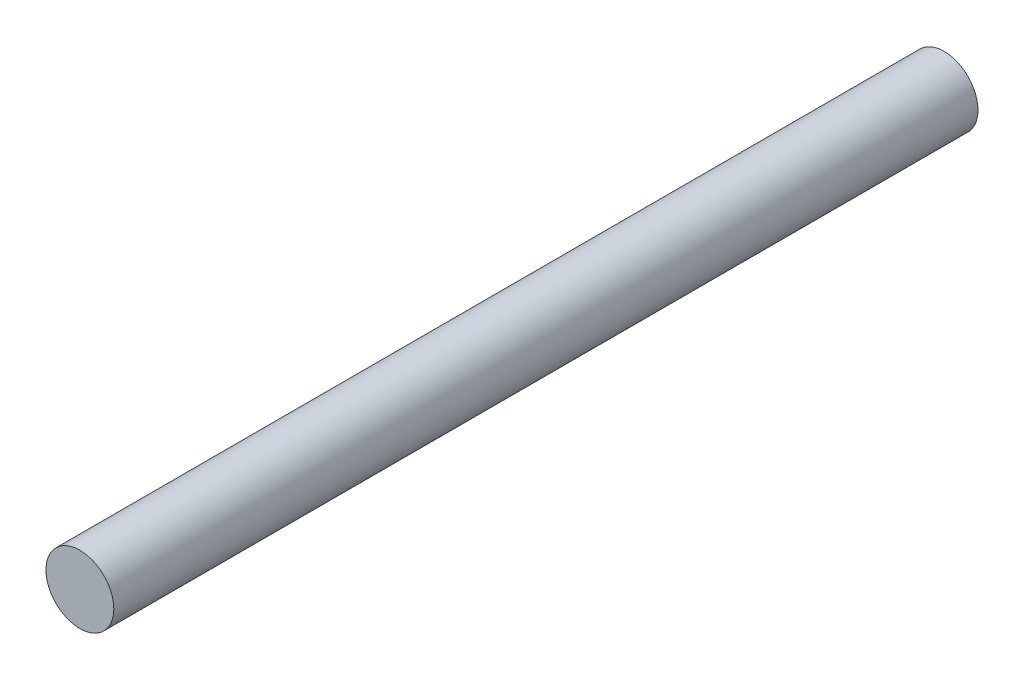
ISO-10303-21;
HEADER;
FILE_DESCRIPTION(('STEP AP214'),'2;1');
FILE_NAME('part.step','',(''),(''),'','','');
FILE_SCHEMA(('AUTOMOTIVE_DESIGN { 1 0 10303 214 1 1 1 1 }'));
ENDSEC;
DATA;
#1=APPLICATION_CONTEXT('core data for automotive mechanical design processes');
#2=APPLICATION_PROTOCOL_DEFINITION('international standard','automotive_design',2000,#1);
#3=PRODUCT_CONTEXT('',#1,'mechanical');
#4=PRODUCT('Part','Part','',(#3));
#5=PRODUCT_RELATED_PRODUCT_CATEGORY('part','',(#4));
#6=PRODUCT_DEFINITION_FORMATION('','',#4);
#7=PRODUCT_DEFINITION_CONTEXT('part definition',#1,'design');
#8=PRODUCT_DEFINITION('design','',#6,#7);
#9=PRODUCT_DEFINITION_SHAPE('','',#8);
#10=(LENGTH_UNIT() NAMED_UNIT(*) SI_UNIT(.MILLI.,.METRE.));
#11=(NAMED_UNIT(*) PLANE_ANGLE_UNIT() SI_UNIT($,.RADIAN.));
#12=(NAMED_UNIT(*) SI_UNIT($,.STERADIAN.) SOLID_ANGLE_UNIT());
#13=UNCERTAINTY_MEASURE_WITH_UNIT(LENGTH_MEASURE(1.E-05),#10,'distance_accuracy_value','');
#14=(GEOMETRIC_REPRESENTATION_CONTEXT(3) GLOBAL_UNCERTAINTY_ASSIGNED_CONTEXT((#13)) GLOBAL_UNIT_ASSIGNED_CONTEXT((#10,
#11,#12)) REPRESENTATION_CONTEXT('',''));
#15=CARTESIAN_POINT('',(0.,0.,0.));
#16=DIRECTION('',(0.,0.,1.));
#17=DIRECTION('',(1.,0.,0.));
#18=AXIS2_PLACEMENT_3D('',#15,#16,#17);
#19=CARTESIAN_POINT('',(0.,0.,-53.2));
#20=DIRECTION('',(0.,0.,1.));
#21=DIRECTION('',(1.,0.,0.));
#22=AXIS2_PLACEMENT_3D('',#19,#20,#21);
#23=CYLINDRICAL_SURFACE('',#22,8.89);
#24=CARTESIAN_POINT('',(0.,0.,-53.2));
#25=DIRECTION('',(0.,0.,1.));
#26=DIRECTION('',(1.,0.,0.));
#27=AXIS2_PLACEMENT_3D('',#24,#25,#26);
#28=CIRCLE('',#27,8.89);
#29=CARTESIAN_POINT('',(8.89,0.,-53.2));
#30=VERTEX_POINT('',#29);
#31=EDGE_CURVE('E10',#30,#30,#28,.T.);
#32=ORIENTED_EDGE('',*,*,#31,.T.);
#33=EDGE_LOOP('',(#32));
#34=FACE_BOUND('',#33,.T.);
#35=CARTESIAN_POINT('',(0.,0.,173.2));
#36=DIRECTION('',(0.,0.,1.));
#37=DIRECTION('',(1.,0.,0.));
#38=AXIS2_PLACEMENT_3D('',#35,#36,#37);
#39=CIRCLE('',#38,8.89);
#40=CARTESIAN_POINT('',(8.89,0.,173.2));
#41=VERTEX_POINT('',#40);
#42=EDGE_CURVE('E43',#41,#41,#39,.T.);
#43=ORIENTED_EDGE('',*,*,#42,.F.);
#44=EDGE_LOOP('',(#43));
#45=FACE_BOUND('',#44,.T.);
#46=ADVANCED_FACE('F37',(#34,#45),#23,.T.);
#47=CARTESIAN_POINT('',(0.,0.,-53.2));
#48=DIRECTION('',(0.,0.,1.));
#49=DIRECTION('',(1.,0.,0.));
#50=AXIS2_PLACEMENT_3D('',#47,#48,#49);
#51=PLANE('',#50);
#52=ORIENTED_EDGE('',*,*,#31,.F.);
#53=EDGE_LOOP('',(#52));
#54=FACE_BOUND('',#53,.T.);
#55=ADVANCED_FACE('F52',(#54),#51,.F.);
#56=CARTESIAN_POINT('',(0.,0.,173.2));
#57=DIRECTION('',(0.,0.,1.));
#58=DIRECTION('',(1.,0.,0.));
#59=AXIS2_PLACEMENT_3D('',#56,#57,#58);
#60=PLANE('',#59);
#61=ORIENTED_EDGE('',*,*,#42,.T.);
#62=EDGE_LOOP('',(#61));
#63=FACE_BOUND('',#62,.T.);
#64=ADVANCED_FACE('F49',(#63),#60,.T.);
#65=CLOSED_SHELL('',(#46,#55,#64));
#66=MANIFOLD_SOLID_BREP('B2',#65);
#67=ADVANCED_BREP_SHAPE_REPRESENTATION('',(#18,#66),#14);
#68=SHAPE_DEFINITION_REPRESENTATION(#9,#67);
ENDSEC;
END-ISO-10303-21;
